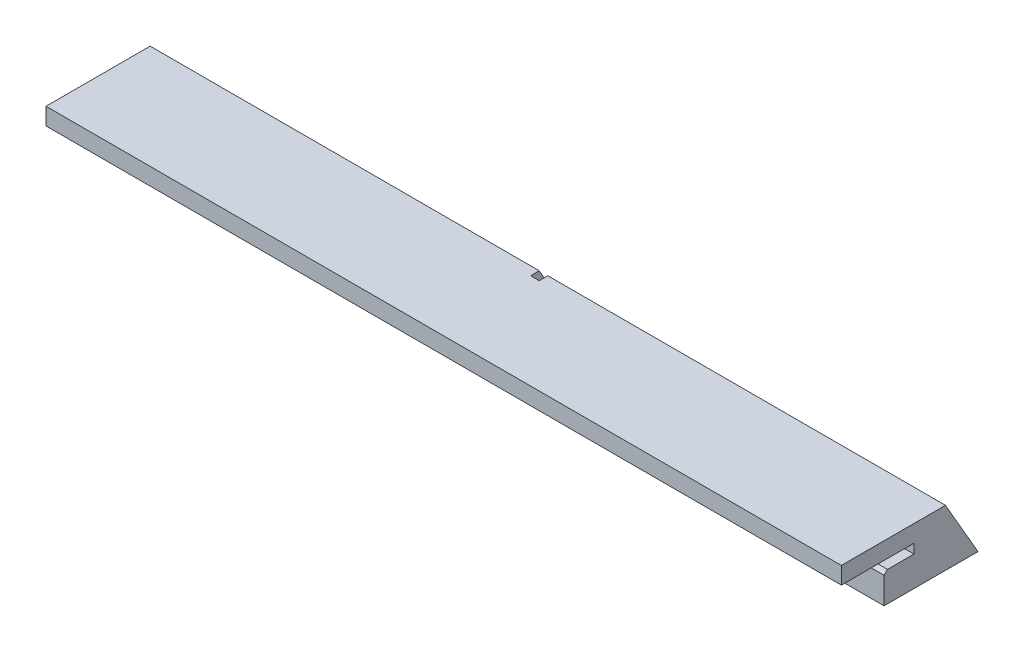
ISO-10303-21;
HEADER;
FILE_DESCRIPTION(('STEP AP214'),'2;1');
FILE_NAME('part.step','',(''),(''),'','','');
FILE_SCHEMA(('AUTOMOTIVE_DESIGN { 1 0 10303 214 1 1 1 1 }'));
ENDSEC;
DATA;
#1=APPLICATION_CONTEXT('core data for automotive mechanical design processes');
#2=APPLICATION_PROTOCOL_DEFINITION('international standard','automotive_design',2000,#1);
#3=PRODUCT_CONTEXT('',#1,'mechanical');
#4=PRODUCT('Part','Part','',(#3));
#5=PRODUCT_RELATED_PRODUCT_CATEGORY('part','',(#4));
#6=PRODUCT_DEFINITION_FORMATION('','',#4);
#7=PRODUCT_DEFINITION_CONTEXT('part definition',#1,'design');
#8=PRODUCT_DEFINITION('design','',#6,#7);
#9=PRODUCT_DEFINITION_SHAPE('','',#8);
#10=(LENGTH_UNIT() NAMED_UNIT(*) SI_UNIT(.MILLI.,.METRE.));
#11=(NAMED_UNIT(*) PLANE_ANGLE_UNIT() SI_UNIT($,.RADIAN.));
#12=(NAMED_UNIT(*) SI_UNIT($,.STERADIAN.) SOLID_ANGLE_UNIT());
#13=UNCERTAINTY_MEASURE_WITH_UNIT(LENGTH_MEASURE(1.E-05),#10,'distance_accuracy_value','');
#14=(GEOMETRIC_REPRESENTATION_CONTEXT(3) GLOBAL_UNCERTAINTY_ASSIGNED_CONTEXT((#13)) GLOBAL_UNIT_ASSIGNED_CONTEXT((#10,
#11,#12)) REPRESENTATION_CONTEXT('',''));
#15=CARTESIAN_POINT('',(0.,0.,0.));
#16=DIRECTION('',(0.,0.,1.));
#17=DIRECTION('',(1.,0.,0.));
#18=AXIS2_PLACEMENT_3D('',#15,#16,#17);
#19=CARTESIAN_POINT('',(0.,4.33012701892216,-8.50000000000006));
#20=DIRECTION('',(0.,0.499999999999995,-0.866025403784442));
#21=DIRECTION('',(0.,0.866025403784442,0.499999999999995));
#22=AXIS2_PLACEMENT_3D('',#19,#20,#21);
#23=PLANE('',#22);
#24=DIRECTION('',(0.,-0.866025403784442,-0.499999999999995));
#25=VECTOR('',#24,1.);
#26=CARTESIAN_POINT('',(46.55,6.6,-7.18948822334853));
#27=LINE('',#26,#25);
#28=CARTESIAN_POINT('',(46.55,6.6,-7.18948822334853));
#29=VERTEX_POINT('',#28);
#30=CARTESIAN_POINT('',(46.55,0.,-11.));
#31=VERTEX_POINT('',#30);
#32=EDGE_CURVE('E185',#29,#31,#27,.T.);
#33=ORIENTED_EDGE('',*,*,#32,.F.);
#34=DIRECTION('',(1.,0.,0.));
#35=VECTOR('',#34,1.);
#36=CARTESIAN_POINT('',(0.,6.6,-7.18948822334853));
#37=LINE('',#36,#35);
#38=CARTESIAN_POINT('',(93.1,6.6,-7.18948822334853));
#39=VERTEX_POINT('',#38);
#40=EDGE_CURVE('E222',#29,#39,#37,.T.);
#41=ORIENTED_EDGE('',*,*,#40,.T.);
#42=DIRECTION('',(0.,-0.866025403784442,-0.499999999999995));
#43=VECTOR('',#42,1.);
#44=CARTESIAN_POINT('',(93.1,6.6,-7.18948822334853));
#45=LINE('',#44,#43);
#46=CARTESIAN_POINT('',(93.1,0.,-11.));
#47=VERTEX_POINT('',#46);
#48=EDGE_CURVE('E226',#39,#47,#45,.T.);
#49=ORIENTED_EDGE('',*,*,#48,.T.);
#50=DIRECTION('',(-1.,0.,0.));
#51=VECTOR('',#50,1.);
#52=CARTESIAN_POINT('',(93.1,0.,-11.));
#53=LINE('',#52,#51);
#54=EDGE_CURVE('E217',#47,#31,#53,.T.);
#55=ORIENTED_EDGE('',*,*,#54,.T.);
#56=EDGE_LOOP('',(#33,#41,#49,#55));
#57=FACE_BOUND('',#56,.T.);
#58=ADVANCED_FACE('F43',(#57),#23,.T.);
#59=CARTESIAN_POINT('',(0.,3.5,0.));
#60=DIRECTION('',(0.,0.,-1.));
#61=DIRECTION('',(-1.,0.,0.));
#62=AXIS2_PLACEMENT_3D('',#59,#60,#61);
#63=PLANE('',#62);
#64=DIRECTION('',(0.,-1.,0.));
#65=VECTOR('',#64,1.);
#66=CARTESIAN_POINT('',(88.1,4.6,0.));
#67=LINE('',#66,#65);
#68=CARTESIAN_POINT('',(88.1,4.6,0.));
#69=VERTEX_POINT('',#68);
#70=CARTESIAN_POINT('',(88.1,3.1,0.));
#71=VERTEX_POINT('',#70);
#72=EDGE_CURVE('E253',#69,#71,#67,.T.);
#73=ORIENTED_EDGE('',*,*,#72,.F.);
#74=DIRECTION('',(1.,0.,0.));
#75=VECTOR('',#74,1.);
#76=CARTESIAN_POINT('',(0.,4.6,0.));
#77=LINE('',#76,#75);
#78=CARTESIAN_POINT('',(76.399623113199,4.6,0.));
#79=VERTEX_POINT('',#78);
#80=EDGE_CURVE('E229',#79,#69,#77,.T.);
#81=ORIENTED_EDGE('',*,*,#80,.F.);
#82=DIRECTION('',(0.,-1.,0.));
#83=VECTOR('',#82,1.);
#84=CARTESIAN_POINT('',(76.399623113199,6.601,0.));
#85=LINE('',#84,#83);
#86=CARTESIAN_POINT('',(76.399623113199,0.,0.));
#87=VERTEX_POINT('',#86);
#88=EDGE_CURVE('E247',#87,#79,#85,.F.);
#89=ORIENTED_EDGE('',*,*,#88,.F.);
#90=DIRECTION('',(1.,0.,0.));
#91=VECTOR('',#90,1.);
#92=CARTESIAN_POINT('',(0.,0.,0.));
#93=LINE('',#92,#91);
#94=CARTESIAN_POINT('',(93.1,0.,0.));
#95=VERTEX_POINT('',#94);
#96=EDGE_CURVE('E305',#87,#95,#93,.T.);
#97=ORIENTED_EDGE('',*,*,#96,.T.);
#98=DIRECTION('',(0.,-1.,0.));
#99=VECTOR('',#98,1.);
#100=CARTESIAN_POINT('',(93.1,3.5,0.));
#101=LINE('',#100,#99);
#102=CARTESIAN_POINT('',(93.1,3.1,0.));
#103=VERTEX_POINT('',#102);
#104=EDGE_CURVE('E302',#103,#95,#101,.T.);
#105=ORIENTED_EDGE('',*,*,#104,.F.);
#106=DIRECTION('',(-1.,0.,0.));
#107=VECTOR('',#106,1.);
#108=CARTESIAN_POINT('',(0.,3.1,0.));
#109=LINE('',#108,#107);
#110=EDGE_CURVE('E317',#103,#71,#109,.T.);
#111=ORIENTED_EDGE('',*,*,#110,.T.);
#112=EDGE_LOOP('',(#73,#81,#89,#97,#105,#111));
#113=FACE_BOUND('',#112,.T.);
#114=ADVANCED_FACE('F357',(#113),#63,.F.);
#115=CARTESIAN_POINT('',(0.,3.5,0.));
#116=DIRECTION('',(0.,-1.,0.));
#117=DIRECTION('',(0.,0.,-1.));
#118=AXIS2_PLACEMENT_3D('',#115,#116,#117);
#119=PLANE('',#118);
#120=DIRECTION('',(0.,0.,-1.));
#121=VECTOR('',#120,1.);
#122=CARTESIAN_POINT('',(88.1,3.5,83.1072800661891));
#123=LINE('',#122,#121);
#124=CARTESIAN_POINT('',(88.1,3.5,-0.399999999999984));
#125=VERTEX_POINT('',#124);
#126=CARTESIAN_POINT('',(88.1,3.5,-3.5));
#127=VERTEX_POINT('',#126);
#128=EDGE_CURVE('E269',#125,#127,#123,.T.);
#129=ORIENTED_EDGE('',*,*,#128,.F.);
#130=DIRECTION('',(1.,0.,0.));
#131=VECTOR('',#130,1.);
#132=CARTESIAN_POINT('',(0.,3.5,-0.399999999999984));
#133=LINE('',#132,#131);
#134=CARTESIAN_POINT('',(93.1,3.5,-0.399999999999984));
#135=VERTEX_POINT('',#134);
#136=EDGE_CURVE('E324',#125,#135,#133,.T.);
#137=ORIENTED_EDGE('',*,*,#136,.T.);
#138=DIRECTION('',(0.,0.,-1.));
#139=VECTOR('',#138,1.);
#140=CARTESIAN_POINT('',(93.1,3.5,0.));
#141=LINE('',#140,#139);
#142=CARTESIAN_POINT('',(93.1,3.5,-3.5));
#143=VERTEX_POINT('',#142);
#144=EDGE_CURVE('E299',#135,#143,#141,.T.);
#145=ORIENTED_EDGE('',*,*,#144,.T.);
#146=DIRECTION('',(1.,0.,0.));
#147=VECTOR('',#146,1.);
#148=CARTESIAN_POINT('',(0.,3.5,-3.5));
#149=LINE('',#148,#147);
#150=EDGE_CURVE('E278',#127,#143,#149,.T.);
#151=ORIENTED_EDGE('',*,*,#150,.F.);
#152=EDGE_LOOP('',(#129,#137,#145,#151));
#153=FACE_BOUND('',#152,.T.);
#154=ADVANCED_FACE('F388',(#153),#119,.F.);
#155=DIRECTION('',(0.,0.,1.));
#156=VECTOR('',#155,1.);
#157=CARTESIAN_POINT('',(0.,3.5,0.));
#158=LINE('',#157,#156);
#159=CARTESIAN_POINT('',(0.,3.5,-3.5));
#160=VERTEX_POINT('',#159);
#161=CARTESIAN_POINT('',(0.,3.5,-0.399999999999984));
#162=VERTEX_POINT('',#161);
#163=EDGE_CURVE('E296',#160,#162,#158,.T.);
#164=ORIENTED_EDGE('',*,*,#163,.T.);
#165=DIRECTION('',(1.,0.,0.));
#166=VECTOR('',#165,1.);
#167=CARTESIAN_POINT('',(0.,3.5,-0.399999999999984));
#168=LINE('',#167,#166);
#169=CARTESIAN_POINT('',(5.,3.5,-0.399999999999984));
#170=VERTEX_POINT('',#169);
#171=EDGE_CURVE('E314',#162,#170,#168,.T.);
#172=ORIENTED_EDGE('',*,*,#171,.T.);
#173=DIRECTION('',(0.,0.,-1.));
#174=VECTOR('',#173,1.);
#175=CARTESIAN_POINT('',(5.,3.5,83.1072800661891));
#176=LINE('',#175,#174);
#177=CARTESIAN_POINT('',(5.,3.5,-3.5));
#178=VERTEX_POINT('',#177);
#179=EDGE_CURVE('E256',#170,#178,#176,.T.);
#180=ORIENTED_EDGE('',*,*,#179,.T.);
#181=EDGE_CURVE('E287',#160,#178,#149,.T.);
#182=ORIENTED_EDGE('',*,*,#181,.F.);
#183=EDGE_LOOP('',(#164,#172,#180,#182));
#184=FACE_BOUND('',#183,.T.);
#185=ADVANCED_FACE('F386',(#184),#119,.F.);
#186=CARTESIAN_POINT('',(0.,4.6,-3.5));
#187=DIRECTION('',(0.,0.,-1.));
#188=DIRECTION('',(-1.,0.,0.));
#189=AXIS2_PLACEMENT_3D('',#186,#187,#188);
#190=PLANE('',#189);
#191=DIRECTION('',(0.,1.,0.));
#192=VECTOR('',#191,1.);
#193=CARTESIAN_POINT('',(88.1,4.6,-3.5));
#194=LINE('',#193,#192);
#195=CARTESIAN_POINT('',(88.1,4.6,-3.5));
#196=VERTEX_POINT('',#195);
#197=EDGE_CURVE('E262',#127,#196,#194,.T.);
#198=ORIENTED_EDGE('',*,*,#197,.F.);
#199=ORIENTED_EDGE('',*,*,#150,.T.);
#200=DIRECTION('',(0.,-1.,0.));
#201=VECTOR('',#200,1.);
#202=CARTESIAN_POINT('',(93.1,4.6,-3.5));
#203=LINE('',#202,#201);
#204=CARTESIAN_POINT('',(93.1,4.6,-3.5));
#205=VERTEX_POINT('',#204);
#206=EDGE_CURVE('E285',#205,#143,#203,.T.);
#207=ORIENTED_EDGE('',*,*,#206,.F.);
#208=DIRECTION('',(1.,0.,0.));
#209=VECTOR('',#208,1.);
#210=CARTESIAN_POINT('',(0.,4.6,-3.5));
#211=LINE('',#210,#209);
#212=EDGE_CURVE('E286',#196,#205,#211,.T.);
#213=ORIENTED_EDGE('',*,*,#212,.F.);
#214=EDGE_LOOP('',(#198,#199,#207,#213));
#215=FACE_BOUND('',#214,.T.);
#216=ADVANCED_FACE('F368',(#215),#190,.F.);
#217=DIRECTION('',(0.,-1.,0.));
#218=VECTOR('',#217,1.);
#219=CARTESIAN_POINT('',(5.,4.6,-3.5));
#220=LINE('',#219,#218);
#221=CARTESIAN_POINT('',(5.,4.6,-3.5));
#222=VERTEX_POINT('',#221);
#223=EDGE_CURVE('E252',#222,#178,#220,.T.);
#224=ORIENTED_EDGE('',*,*,#223,.F.);
#225=CARTESIAN_POINT('',(0.,4.6,-3.5));
#226=VERTEX_POINT('',#225);
#227=EDGE_CURVE('E282',#226,#222,#211,.T.);
#228=ORIENTED_EDGE('',*,*,#227,.F.);
#229=DIRECTION('',(0.,-1.,0.));
#230=VECTOR('',#229,1.);
#231=CARTESIAN_POINT('',(0.,4.6,-3.5));
#232=LINE('',#231,#230);
#233=EDGE_CURVE('E292',#226,#160,#232,.T.);
#234=ORIENTED_EDGE('',*,*,#233,.T.);
#235=ORIENTED_EDGE('',*,*,#181,.T.);
#236=EDGE_LOOP('',(#224,#228,#234,#235));
#237=FACE_BOUND('',#236,.T.);
#238=ADVANCED_FACE('F384',(#237),#190,.F.);
#239=CARTESIAN_POINT('',(0.,4.6,0.));
#240=DIRECTION('',(0.,1.,0.));
#241=DIRECTION('',(0.,0.,1.));
#242=AXIS2_PLACEMENT_3D('',#239,#240,#241);
#243=PLANE('',#242);
#244=DIRECTION('',(0.,0.,-1.));
#245=VECTOR('',#244,1.);
#246=CARTESIAN_POINT('',(5.,4.6,83.1072800661891));
#247=LINE('',#246,#245);
#248=CARTESIAN_POINT('',(5.,4.6,0.));
#249=VERTEX_POINT('',#248);
#250=EDGE_CURVE('E264',#249,#222,#247,.T.);
#251=ORIENTED_EDGE('',*,*,#250,.F.);
#252=CARTESIAN_POINT('',(16.7003768868009,4.6,0.));
#253=VERTEX_POINT('',#252);
#254=EDGE_CURVE('E67',#249,#253,#77,.T.);
#255=ORIENTED_EDGE('',*,*,#254,.T.);
#256=CARTESIAN_POINT('',(46.55,4.6,147.));
#257=DIRECTION('',(0.,-1.,0.));
#258=DIRECTION('',(0.,0.,-1.));
#259=AXIS2_PLACEMENT_3D('',#256,#257,#258);
#260=CIRCLE('',#259,150.);
#261=EDGE_CURVE('E242',#253,#79,#260,.T.);
#262=ORIENTED_EDGE('',*,*,#261,.T.);
#263=ORIENTED_EDGE('',*,*,#80,.T.);
#264=DIRECTION('',(0.,0.,-1.));
#265=VECTOR('',#264,1.);
#266=CARTESIAN_POINT('',(88.1,4.6,83.1072800661891));
#267=LINE('',#266,#265);
#268=EDGE_CURVE('E266',#69,#196,#267,.T.);
#269=ORIENTED_EDGE('',*,*,#268,.T.);
#270=ORIENTED_EDGE('',*,*,#212,.T.);
#271=DIRECTION('',(0.,0.,-1.));
#272=VECTOR('',#271,1.);
#273=CARTESIAN_POINT('',(93.1,4.6,-10.));
#274=LINE('',#273,#272);
#275=CARTESIAN_POINT('',(93.1,4.6,5.));
#276=VERTEX_POINT('',#275);
#277=EDGE_CURVE('E275',#276,#205,#274,.T.);
#278=ORIENTED_EDGE('',*,*,#277,.F.);
#279=DIRECTION('',(1.,0.,0.));
#280=VECTOR('',#279,1.);
#281=CARTESIAN_POINT('',(0.,4.6,5.));
#282=LINE('',#281,#280);
#283=CARTESIAN_POINT('',(0.,4.6,5.));
#284=VERTEX_POINT('',#283);
#285=EDGE_CURVE('E233',#284,#276,#282,.T.);
#286=ORIENTED_EDGE('',*,*,#285,.F.);
#287=DIRECTION('',(0.,0.,1.));
#288=VECTOR('',#287,1.);
#289=CARTESIAN_POINT('',(0.,4.6,-10.));
#290=LINE('',#289,#288);
#291=EDGE_CURVE('E259',#226,#284,#290,.T.);
#292=ORIENTED_EDGE('',*,*,#291,.F.);
#293=ORIENTED_EDGE('',*,*,#227,.T.);
#294=EDGE_LOOP('',(#251,#255,#262,#263,#269,#270,#278,#286,#292,#293));
#295=FACE_BOUND('',#294,.T.);
#296=ADVANCED_FACE('F353',(#295),#243,.F.);
#297=CARTESIAN_POINT('',(0.,3.5,0.));
#298=DIRECTION('',(1.,0.,0.));
#299=DIRECTION('',(0.,0.,-1.));
#300=AXIS2_PLACEMENT_3D('',#297,#298,#299);
#301=PLANE('',#300);
#302=DIRECTION('',(0.,-1.,0.));
#303=VECTOR('',#302,1.);
#304=CARTESIAN_POINT('',(0.,3.5,0.));
#305=LINE('',#304,#303);
#306=CARTESIAN_POINT('',(0.,3.1,0.));
#307=VERTEX_POINT('',#306);
#308=CARTESIAN_POINT('',(0.,0.,0.));
#309=VERTEX_POINT('',#308);
#310=EDGE_CURVE('E312',#307,#309,#305,.T.);
#311=ORIENTED_EDGE('',*,*,#310,.F.);
#312=DIRECTION('',(0.,-0.70710678118656,0.707106781186535));
#313=VECTOR('',#312,1.);
#314=CARTESIAN_POINT('',(0.,3.5,-0.399999999999984));
#315=LINE('',#314,#313);
#316=EDGE_CURVE('E322',#307,#162,#315,.F.);
#317=ORIENTED_EDGE('',*,*,#316,.T.);
#318=ORIENTED_EDGE('',*,*,#163,.F.);
#319=ORIENTED_EDGE('',*,*,#233,.F.);
#320=ORIENTED_EDGE('',*,*,#291,.T.);
#321=DIRECTION('',(0.,-1.,0.));
#322=VECTOR('',#321,1.);
#323=CARTESIAN_POINT('',(0.,4.6,5.));
#324=LINE('',#323,#322);
#325=CARTESIAN_POINT('',(0.,6.6,5.));
#326=VERTEX_POINT('',#325);
#327=EDGE_CURVE('E230',#326,#284,#324,.T.);
#328=ORIENTED_EDGE('',*,*,#327,.F.);
#329=DIRECTION('',(0.,0.,1.));
#330=VECTOR('',#329,1.);
#331=CARTESIAN_POINT('',(0.,6.6,-10.));
#332=LINE('',#331,#330);
#333=CARTESIAN_POINT('',(0.,6.6,-7.18948822334853));
#334=VERTEX_POINT('',#333);
#335=EDGE_CURVE('E272',#334,#326,#332,.T.);
#336=ORIENTED_EDGE('',*,*,#335,.F.);
#337=DIRECTION('',(0.,0.866025403784442,0.499999999999995));
#338=VECTOR('',#337,1.);
#339=CARTESIAN_POINT('',(0.,0.,-11.));
#340=LINE('',#339,#338);
#341=CARTESIAN_POINT('',(0.,0.,-11.));
#342=VERTEX_POINT('',#341);
#343=EDGE_CURVE('E219',#342,#334,#340,.T.);
#344=ORIENTED_EDGE('',*,*,#343,.F.);
#345=DIRECTION('',(0.,0.,1.));
#346=VECTOR('',#345,1.);
#347=CARTESIAN_POINT('',(0.,0.,0.));
#348=LINE('',#347,#346);
#349=EDGE_CURVE('E295',#342,#309,#348,.T.);
#350=ORIENTED_EDGE('',*,*,#349,.T.);
#351=EDGE_LOOP('',(#311,#317,#318,#319,#320,#328,#336,#344,#350));
#352=FACE_BOUND('',#351,.T.);
#353=ADVANCED_FACE('F343',(#352),#301,.F.);
#354=DIRECTION('',(0.,-1.,0.));
#355=VECTOR('',#354,1.);
#356=CARTESIAN_POINT('',(16.7003768868009,6.601,0.));
#357=LINE('',#356,#355);
#358=CARTESIAN_POINT('',(16.7003768868009,0.,0.));
#359=VERTEX_POINT('',#358);
#360=EDGE_CURVE('E245',#253,#359,#357,.T.);
#361=ORIENTED_EDGE('',*,*,#360,.F.);
#362=ORIENTED_EDGE('',*,*,#254,.F.);
#363=DIRECTION('',(0.,1.,0.));
#364=VECTOR('',#363,1.);
#365=CARTESIAN_POINT('',(5.,4.6,0.));
#366=LINE('',#365,#364);
#367=CARTESIAN_POINT('',(5.,3.1,0.));
#368=VERTEX_POINT('',#367);
#369=EDGE_CURVE('E255',#368,#249,#366,.T.);
#370=ORIENTED_EDGE('',*,*,#369,.F.);
#371=DIRECTION('',(-1.,0.,0.));
#372=VECTOR('',#371,1.);
#373=CARTESIAN_POINT('',(0.,3.1,0.));
#374=LINE('',#373,#372);
#375=EDGE_CURVE('E320',#368,#307,#374,.T.);
#376=ORIENTED_EDGE('',*,*,#375,.T.);
#377=ORIENTED_EDGE('',*,*,#310,.T.);
#378=EDGE_CURVE('E306',#309,#359,#93,.T.);
#379=ORIENTED_EDGE('',*,*,#378,.T.);
#380=EDGE_LOOP('',(#361,#362,#370,#376,#377,#379));
#381=FACE_BOUND('',#380,.T.);
#382=ADVANCED_FACE('F340',(#381),#63,.F.);
#383=CARTESIAN_POINT('',(93.1,3.5,0.));
#384=DIRECTION('',(-1.,0.,0.));
#385=DIRECTION('',(0.,0.,1.));
#386=AXIS2_PLACEMENT_3D('',#383,#384,#385);
#387=PLANE('',#386);
#388=ORIENTED_EDGE('',*,*,#144,.F.);
#389=DIRECTION('',(0.,0.70710678118656,-0.707106781186535));
#390=VECTOR('',#389,1.);
#391=CARTESIAN_POINT('',(93.1,3.5,-0.399999999999984));
#392=LINE('',#391,#390);
#393=EDGE_CURVE('E327',#135,#103,#392,.F.);
#394=ORIENTED_EDGE('',*,*,#393,.T.);
#395=ORIENTED_EDGE('',*,*,#104,.T.);
#396=DIRECTION('',(0.,0.,-1.));
#397=VECTOR('',#396,1.);
#398=CARTESIAN_POINT('',(93.1,0.,0.));
#399=LINE('',#398,#397);
#400=EDGE_CURVE('E300',#95,#47,#399,.T.);
#401=ORIENTED_EDGE('',*,*,#400,.T.);
#402=ORIENTED_EDGE('',*,*,#48,.F.);
#403=DIRECTION('',(0.,0.,-1.));
#404=VECTOR('',#403,1.);
#405=CARTESIAN_POINT('',(93.1,6.6,-10.));
#406=LINE('',#405,#404);
#407=CARTESIAN_POINT('',(93.1,6.6,5.));
#408=VERTEX_POINT('',#407);
#409=EDGE_CURVE('E274',#408,#39,#406,.T.);
#410=ORIENTED_EDGE('',*,*,#409,.F.);
#411=DIRECTION('',(0.,1.,0.));
#412=VECTOR('',#411,1.);
#413=CARTESIAN_POINT('',(93.1,4.6,5.));
#414=LINE('',#413,#412);
#415=EDGE_CURVE('E236',#276,#408,#414,.T.);
#416=ORIENTED_EDGE('',*,*,#415,.F.);
#417=ORIENTED_EDGE('',*,*,#277,.T.);
#418=ORIENTED_EDGE('',*,*,#206,.T.);
#419=EDGE_LOOP('',(#388,#394,#395,#401,#402,#410,#416,#417,#418));
#420=FACE_BOUND('',#419,.T.);
#421=ADVANCED_FACE('F374',(#420),#387,.F.);
#422=CARTESIAN_POINT('',(0.,0.,0.));
#423=DIRECTION('',(0.,-1.,0.));
#424=DIRECTION('',(0.,0.,-1.));
#425=AXIS2_PLACEMENT_3D('',#422,#423,#424);
#426=PLANE('',#425);
#427=DIRECTION('',(0.,0.,-1.));
#428=VECTOR('',#427,1.);
#429=CARTESIAN_POINT('',(46.55,0.,-10.));
#430=LINE('',#429,#428);
#431=CARTESIAN_POINT('',(46.55,0.,-10.));
#432=VERTEX_POINT('',#431);
#433=EDGE_CURVE('E179',#432,#31,#430,.T.);
#434=ORIENTED_EDGE('',*,*,#433,.T.);
#435=ORIENTED_EDGE('',*,*,#54,.F.);
#436=ORIENTED_EDGE('',*,*,#400,.F.);
#437=ORIENTED_EDGE('',*,*,#96,.F.);
#438=CARTESIAN_POINT('',(46.55,0.,147.));
#439=DIRECTION('',(0.,-1.,0.));
#440=DIRECTION('',(0.,0.,-1.));
#441=AXIS2_PLACEMENT_3D('',#438,#439,#440);
#442=CIRCLE('',#441,150.);
#443=EDGE_CURVE('E250',#359,#87,#442,.T.);
#444=ORIENTED_EDGE('',*,*,#443,.F.);
#445=ORIENTED_EDGE('',*,*,#378,.F.);
#446=ORIENTED_EDGE('',*,*,#349,.F.);
#447=CARTESIAN_POINT('',(45.55,0.,-11.));
#448=VERTEX_POINT('',#447);
#449=EDGE_CURVE('E212',#448,#342,#53,.T.);
#450=ORIENTED_EDGE('',*,*,#449,.F.);
#451=DIRECTION('',(0.,0.,-1.));
#452=VECTOR('',#451,1.);
#453=CARTESIAN_POINT('',(45.55,0.,-10.));
#454=LINE('',#453,#452);
#455=CARTESIAN_POINT('',(45.55,0.,-10.));
#456=VERTEX_POINT('',#455);
#457=EDGE_CURVE('E59',#456,#448,#454,.T.);
#458=ORIENTED_EDGE('',*,*,#457,.F.);
#459=DIRECTION('',(-1.,0.,0.));
#460=VECTOR('',#459,1.);
#461=CARTESIAN_POINT('',(46.55,0.,-10.));
#462=LINE('',#461,#460);
#463=EDGE_CURVE('E196',#432,#456,#462,.T.);
#464=ORIENTED_EDGE('',*,*,#463,.F.);
#465=EDGE_LOOP('',(#434,#435,#436,#437,#444,#445,#446,#450,#458,#464));
#466=FACE_BOUND('',#465,.T.);
#467=ADVANCED_FACE('F201',(#466),#426,.T.);
#468=CARTESIAN_POINT('',(0.,6.6,0.));
#469=DIRECTION('',(0.,1.,0.));
#470=DIRECTION('',(0.,0.,1.));
#471=AXIS2_PLACEMENT_3D('',#468,#469,#470);
#472=PLANE('',#471);
#473=DIRECTION('',(0.,0.,-1.));
#474=VECTOR('',#473,1.);
#475=CARTESIAN_POINT('',(46.55,6.6,-6.18948822334853));
#476=LINE('',#475,#474);
#477=CARTESIAN_POINT('',(46.55,6.6,-6.18948822334853));
#478=VERTEX_POINT('',#477);
#479=EDGE_CURVE('E210',#478,#29,#476,.T.);
#480=ORIENTED_EDGE('',*,*,#479,.F.);
#481=DIRECTION('',(1.,0.,0.));
#482=VECTOR('',#481,1.);
#483=CARTESIAN_POINT('',(46.55,6.6,-6.18948822334853));
#484=LINE('',#483,#482);
#485=CARTESIAN_POINT('',(45.55,6.60000000000001,-6.18948822334853));
#486=VERTEX_POINT('',#485);
#487=EDGE_CURVE('E190',#486,#478,#484,.T.);
#488=ORIENTED_EDGE('',*,*,#487,.F.);
#489=DIRECTION('',(0.,0.,-1.));
#490=VECTOR('',#489,1.);
#491=CARTESIAN_POINT('',(45.55,6.60000000000001,-6.18948822334853));
#492=LINE('',#491,#490);
#493=CARTESIAN_POINT('',(45.55,6.60000000000001,-7.18948822334853));
#494=VERTEX_POINT('',#493);
#495=EDGE_CURVE('E213',#486,#494,#492,.T.);
#496=ORIENTED_EDGE('',*,*,#495,.T.);
#497=EDGE_CURVE('E223',#334,#494,#37,.T.);
#498=ORIENTED_EDGE('',*,*,#497,.F.);
#499=ORIENTED_EDGE('',*,*,#335,.T.);
#500=DIRECTION('',(-1.,0.,0.));
#501=VECTOR('',#500,1.);
#502=CARTESIAN_POINT('',(0.,6.6,5.));
#503=LINE('',#502,#501);
#504=EDGE_CURVE('E239',#408,#326,#503,.T.);
#505=ORIENTED_EDGE('',*,*,#504,.F.);
#506=ORIENTED_EDGE('',*,*,#409,.T.);
#507=ORIENTED_EDGE('',*,*,#40,.F.);
#508=EDGE_LOOP('',(#480,#488,#496,#498,#499,#505,#506,#507));
#509=FACE_BOUND('',#508,.T.);
#510=ADVANCED_FACE('F420',(#509),#472,.T.);
#511=CARTESIAN_POINT('',(88.1,4.6,83.1072800661891));
#512=DIRECTION('',(-1.,0.,0.));
#513=DIRECTION('',(0.,0.,1.));
#514=AXIS2_PLACEMENT_3D('',#511,#512,#513);
#515=PLANE('',#514);
#516=ORIENTED_EDGE('',*,*,#268,.F.);
#517=ORIENTED_EDGE('',*,*,#72,.T.);
#518=DIRECTION('',(0.,-0.70710678118656,0.707106781186535));
#519=VECTOR('',#518,1.);
#520=CARTESIAN_POINT('',(88.1,-37.7036400330945,40.8036400330931));
#521=LINE('',#520,#519);
#522=EDGE_CURVE('E11',#71,#125,#521,.F.);
#523=ORIENTED_EDGE('',*,*,#522,.T.);
#524=ORIENTED_EDGE('',*,*,#128,.T.);
#525=ORIENTED_EDGE('',*,*,#197,.T.);
#526=EDGE_LOOP('',(#516,#517,#523,#524,#525));
#527=FACE_BOUND('',#526,.T.);
#528=ADVANCED_FACE('F362',(#527),#515,.F.);
#529=CARTESIAN_POINT('',(5.,4.6,83.1072800661891));
#530=DIRECTION('',(1.,0.,0.));
#531=DIRECTION('',(0.,0.,-1.));
#532=AXIS2_PLACEMENT_3D('',#529,#530,#531);
#533=PLANE('',#532);
#534=ORIENTED_EDGE('',*,*,#179,.F.);
#535=DIRECTION('',(0.,0.70710678118656,-0.707106781186535));
#536=VECTOR('',#535,1.);
#537=CARTESIAN_POINT('',(5.,-37.7036400330945,40.8036400330931));
#538=LINE('',#537,#536);
#539=EDGE_CURVE('E52',#170,#368,#538,.F.);
#540=ORIENTED_EDGE('',*,*,#539,.T.);
#541=ORIENTED_EDGE('',*,*,#369,.T.);
#542=ORIENTED_EDGE('',*,*,#250,.T.);
#543=ORIENTED_EDGE('',*,*,#223,.T.);
#544=EDGE_LOOP('',(#534,#540,#541,#542,#543));
#545=FACE_BOUND('',#544,.T.);
#546=ADVANCED_FACE('F332',(#545),#533,.F.);
#547=CARTESIAN_POINT('',(0.,3.5,-0.399999999999984));
#548=DIRECTION('',(0.,-0.707106781186535,-0.70710678118656));
#549=DIRECTION('',(1.,0.,0.));
#550=AXIS2_PLACEMENT_3D('',#547,#548,#549);
#551=PLANE('',#550);
#552=ORIENTED_EDGE('',*,*,#316,.F.);
#553=ORIENTED_EDGE('',*,*,#375,.F.);
#554=ORIENTED_EDGE('',*,*,#539,.F.);
#555=ORIENTED_EDGE('',*,*,#171,.F.);
#556=EDGE_LOOP('',(#552,#553,#554,#555));
#557=FACE_BOUND('',#556,.T.);
#558=ADVANCED_FACE('F336',(#557),#551,.F.);
#559=CARTESIAN_POINT('',(0.,3.5,-0.399999999999984));
#560=DIRECTION('',(0.,-0.707106781186535,-0.70710678118656));
#561=DIRECTION('',(1.,0.,0.));
#562=AXIS2_PLACEMENT_3D('',#559,#560,#561);
#563=PLANE('',#562);
#564=ORIENTED_EDGE('',*,*,#522,.F.);
#565=ORIENTED_EDGE('',*,*,#110,.F.);
#566=ORIENTED_EDGE('',*,*,#393,.F.);
#567=ORIENTED_EDGE('',*,*,#136,.F.);
#568=EDGE_LOOP('',(#564,#565,#566,#567));
#569=FACE_BOUND('',#568,.T.);
#570=ADVANCED_FACE('F46',(#569),#563,.F.);
#571=CARTESIAN_POINT('',(46.55,6.601,147.));
#572=DIRECTION('',(0.,-1.,0.));
#573=DIRECTION('',(0.,0.,-1.));
#574=AXIS2_PLACEMENT_3D('',#571,#572,#573);
#575=CYLINDRICAL_SURFACE('',#574,150.);
#576=ORIENTED_EDGE('',*,*,#88,.T.);
#577=ORIENTED_EDGE('',*,*,#261,.F.);
#578=ORIENTED_EDGE('',*,*,#360,.T.);
#579=ORIENTED_EDGE('',*,*,#443,.T.);
#580=EDGE_LOOP('',(#576,#577,#578,#579));
#581=FACE_BOUND('',#580,.T.);
#582=ADVANCED_FACE('F350',(#581),#575,.F.);
#583=CARTESIAN_POINT('',(0.,0.,5.));
#584=DIRECTION('',(0.,0.,-1.));
#585=DIRECTION('',(-1.,0.,0.));
#586=AXIS2_PLACEMENT_3D('',#583,#584,#585);
#587=PLANE('',#586);
#588=ORIENTED_EDGE('',*,*,#327,.T.);
#589=ORIENTED_EDGE('',*,*,#285,.T.);
#590=ORIENTED_EDGE('',*,*,#415,.T.);
#591=ORIENTED_EDGE('',*,*,#504,.T.);
#592=EDGE_LOOP('',(#588,#589,#590,#591));
#593=FACE_BOUND('',#592,.T.);
#594=ADVANCED_FACE('F378',(#593),#587,.F.);
#595=DIRECTION('',(0.,0.866025403784441,0.499999999999995));
#596=VECTOR('',#595,1.);
#597=CARTESIAN_POINT('',(45.55,6.60000000000001,-7.18948822334853));
#598=LINE('',#597,#596);
#599=EDGE_CURVE('E199',#448,#494,#598,.T.);
#600=ORIENTED_EDGE('',*,*,#599,.F.);
#601=ORIENTED_EDGE('',*,*,#449,.T.);
#602=ORIENTED_EDGE('',*,*,#343,.T.);
#603=ORIENTED_EDGE('',*,*,#497,.T.);
#604=EDGE_LOOP('',(#600,#601,#602,#603));
#605=FACE_BOUND('',#604,.T.);
#606=ADVANCED_FACE('F400',(#605),#23,.T.);
#607=CARTESIAN_POINT('',(46.55,6.6,-6.18948822334853));
#608=DIRECTION('',(1.,0.,0.));
#609=DIRECTION('',(0.,0.,-1.));
#610=AXIS2_PLACEMENT_3D('',#607,#608,#609);
#611=PLANE('',#610);
#612=ORIENTED_EDGE('',*,*,#32,.T.);
#613=ORIENTED_EDGE('',*,*,#433,.F.);
#614=DIRECTION('',(0.,-0.866025403784442,-0.499999999999995));
#615=VECTOR('',#614,1.);
#616=CARTESIAN_POINT('',(46.55,6.6,-6.18948822334853));
#617=LINE('',#616,#615);
#618=EDGE_CURVE('E182',#478,#432,#617,.T.);
#619=ORIENTED_EDGE('',*,*,#618,.F.);
#620=ORIENTED_EDGE('',*,*,#479,.T.);
#621=EDGE_LOOP('',(#612,#613,#619,#620));
#622=FACE_BOUND('',#621,.T.);
#623=ADVANCED_FACE('F181',(#622),#611,.F.);
#624=CARTESIAN_POINT('',(45.55,6.60000000000001,-6.18948822334853));
#625=DIRECTION('',(-1.,0.,0.));
#626=DIRECTION('',(0.,0.,1.));
#627=AXIS2_PLACEMENT_3D('',#624,#625,#626);
#628=PLANE('',#627);
#629=ORIENTED_EDGE('',*,*,#599,.T.);
#630=ORIENTED_EDGE('',*,*,#495,.F.);
#631=DIRECTION('',(0.,0.866025403784441,0.499999999999995));
#632=VECTOR('',#631,1.);
#633=CARTESIAN_POINT('',(45.55,6.60000000000001,-6.18948822334853));
#634=LINE('',#633,#632);
#635=EDGE_CURVE('E203',#456,#486,#634,.T.);
#636=ORIENTED_EDGE('',*,*,#635,.F.);
#637=ORIENTED_EDGE('',*,*,#457,.T.);
#638=EDGE_LOOP('',(#629,#630,#636,#637));
#639=FACE_BOUND('',#638,.T.);
#640=ADVANCED_FACE('F416',(#639),#628,.F.);
#641=CARTESIAN_POINT('',(0.,4.76313972081438,-7.25000000000006));
#642=DIRECTION('',(0.,0.499999999999995,-0.866025403784442));
#643=DIRECTION('',(0.,0.866025403784442,0.499999999999995));
#644=AXIS2_PLACEMENT_3D('',#641,#642,#643);
#645=PLANE('',#644);
#646=ORIENTED_EDGE('',*,*,#618,.T.);
#647=ORIENTED_EDGE('',*,*,#463,.T.);
#648=ORIENTED_EDGE('',*,*,#635,.T.);
#649=ORIENTED_EDGE('',*,*,#487,.T.);
#650=EDGE_LOOP('',(#646,#647,#648,#649));
#651=FACE_BOUND('',#650,.T.);
#652=ADVANCED_FACE('F194',(#651),#645,.T.);
#653=CLOSED_SHELL('',(#58,#114,#154,#185,#216,#238,#296,#353,#382,#421,#467,#510,#528,#546,#558,
#570,#582,#594,#606,#623,#640,#652));
#654=MANIFOLD_SOLID_BREP('B2',#653);
#655=ADVANCED_BREP_SHAPE_REPRESENTATION('',(#18,#654),#14);
#656=SHAPE_DEFINITION_REPRESENTATION(#9,#655);
ENDSEC;
END-ISO-10303-21;
